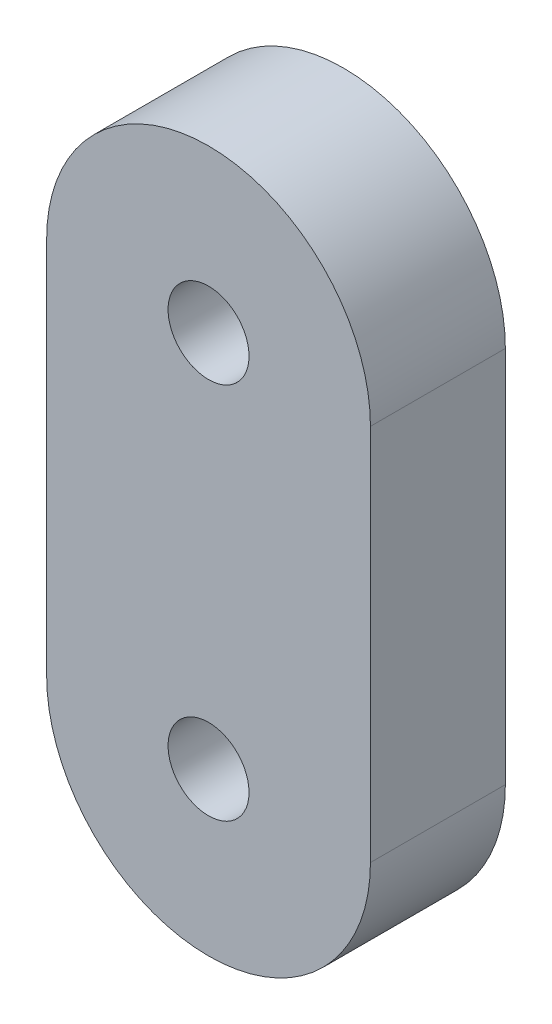
ISO-10303-21;
HEADER;
FILE_DESCRIPTION(('STEP AP214'),'2;1');
FILE_NAME('part.step','',(''),(''),'','','');
FILE_SCHEMA(('AUTOMOTIVE_DESIGN { 1 0 10303 214 1 1 1 1 }'));
ENDSEC;
DATA;
#1=APPLICATION_CONTEXT('core data for automotive mechanical design processes');
#2=APPLICATION_PROTOCOL_DEFINITION('international standard','automotive_design',2000,#1);
#3=PRODUCT_CONTEXT('',#1,'mechanical');
#4=PRODUCT('Part','Part','',(#3));
#5=PRODUCT_RELATED_PRODUCT_CATEGORY('part','',(#4));
#6=PRODUCT_DEFINITION_FORMATION('','',#4);
#7=PRODUCT_DEFINITION_CONTEXT('part definition',#1,'design');
#8=PRODUCT_DEFINITION('design','',#6,#7);
#9=PRODUCT_DEFINITION_SHAPE('','',#8);
#10=(LENGTH_UNIT() NAMED_UNIT(*) SI_UNIT(.MILLI.,.METRE.));
#11=(NAMED_UNIT(*) PLANE_ANGLE_UNIT() SI_UNIT($,.RADIAN.));
#12=(NAMED_UNIT(*) SI_UNIT($,.STERADIAN.) SOLID_ANGLE_UNIT());
#13=UNCERTAINTY_MEASURE_WITH_UNIT(LENGTH_MEASURE(1.E-05),#10,'distance_accuracy_value','');
#14=(GEOMETRIC_REPRESENTATION_CONTEXT(3) GLOBAL_UNCERTAINTY_ASSIGNED_CONTEXT((#13)) GLOBAL_UNIT_ASSIGNED_CONTEXT((#10,
#11,#12)) REPRESENTATION_CONTEXT('',''));
#15=CARTESIAN_POINT('',(0.,0.,0.));
#16=DIRECTION('',(0.,0.,1.));
#17=DIRECTION('',(1.,0.,0.));
#18=AXIS2_PLACEMENT_3D('',#15,#16,#17);
#19=CARTESIAN_POINT('',(0.,0.,5.));
#20=DIRECTION('',(0.,0.,1.));
#21=DIRECTION('',(1.,0.,0.));
#22=AXIS2_PLACEMENT_3D('',#19,#20,#21);
#23=PLANE('',#22);
#24=CARTESIAN_POINT('',(0.,0.,5.));
#25=DIRECTION('',(0.,0.,1.));
#26=DIRECTION('',(1.,0.,0.));
#27=AXIS2_PLACEMENT_3D('',#24,#25,#26);
#28=CIRCLE('',#27,1.5);
#29=CARTESIAN_POINT('',(1.5,0.,5.));
#30=VERTEX_POINT('',#29);
#31=EDGE_CURVE('E100',#30,#30,#28,.T.);
#32=ORIENTED_EDGE('',*,*,#31,.F.);
#33=EDGE_LOOP('',(#32));
#34=FACE_BOUND('',#33,.T.);
#35=CARTESIAN_POINT('',(0.,0.,5.));
#36=DIRECTION('',(0.,0.,1.));
#37=DIRECTION('',(1.,0.,0.));
#38=AXIS2_PLACEMENT_3D('',#35,#36,#37);
#39=CIRCLE('',#38,6.);
#40=CARTESIAN_POINT('',(-6.,0.,5.));
#41=VERTEX_POINT('',#40);
#42=CARTESIAN_POINT('',(6.,0.,5.));
#43=VERTEX_POINT('',#42);
#44=EDGE_CURVE('E85',#41,#43,#39,.T.);
#45=ORIENTED_EDGE('',*,*,#44,.T.);
#46=DIRECTION('',(0.,1.,0.));
#47=VECTOR('',#46,1.);
#48=CARTESIAN_POINT('',(6.,0.,5.));
#49=LINE('',#48,#47);
#50=CARTESIAN_POINT('',(6.,14.,5.));
#51=VERTEX_POINT('',#50);
#52=EDGE_CURVE('E80',#43,#51,#49,.T.);
#53=ORIENTED_EDGE('',*,*,#52,.T.);
#54=CARTESIAN_POINT('',(0.,14.,5.));
#55=DIRECTION('',(0.,0.,1.));
#56=DIRECTION('',(1.,0.,0.));
#57=AXIS2_PLACEMENT_3D('',#54,#55,#56);
#58=CIRCLE('',#57,6.);
#59=CARTESIAN_POINT('',(-6.,14.,5.));
#60=VERTEX_POINT('',#59);
#61=EDGE_CURVE('E83',#51,#60,#58,.T.);
#62=ORIENTED_EDGE('',*,*,#61,.T.);
#63=DIRECTION('',(0.,-1.,0.));
#64=VECTOR('',#63,1.);
#65=CARTESIAN_POINT('',(-6.,0.,5.));
#66=LINE('',#65,#64);
#67=EDGE_CURVE('E50',#60,#41,#66,.T.);
#68=ORIENTED_EDGE('',*,*,#67,.T.);
#69=EDGE_LOOP('',(#45,#53,#62,#68));
#70=FACE_BOUND('',#69,.T.);
#71=CARTESIAN_POINT('',(0.,14.,5.));
#72=DIRECTION('',(0.,0.,1.));
#73=DIRECTION('',(1.,0.,0.));
#74=AXIS2_PLACEMENT_3D('',#71,#72,#73);
#75=CIRCLE('',#74,1.5);
#76=CARTESIAN_POINT('',(1.5,14.,5.));
#77=VERTEX_POINT('',#76);
#78=EDGE_CURVE('E115',#77,#77,#75,.T.);
#79=ORIENTED_EDGE('',*,*,#78,.F.);
#80=EDGE_LOOP('',(#79));
#81=FACE_BOUND('',#80,.T.);
#82=ADVANCED_FACE('F33',(#34,#70,#81),#23,.T.);
#83=CARTESIAN_POINT('',(0.,0.,0.));
#84=DIRECTION('',(0.,0.,1.));
#85=DIRECTION('',(1.,0.,0.));
#86=AXIS2_PLACEMENT_3D('',#83,#84,#85);
#87=PLANE('',#86);
#88=CARTESIAN_POINT('',(0.,0.,0.));
#89=DIRECTION('',(0.,0.,1.));
#90=DIRECTION('',(1.,0.,0.));
#91=AXIS2_PLACEMENT_3D('',#88,#89,#90);
#92=CIRCLE('',#91,1.5);
#93=CARTESIAN_POINT('',(1.5,0.,0.));
#94=VERTEX_POINT('',#93);
#95=EDGE_CURVE('E112',#94,#94,#92,.T.);
#96=ORIENTED_EDGE('',*,*,#95,.T.);
#97=EDGE_LOOP('',(#96));
#98=FACE_BOUND('',#97,.T.);
#99=CARTESIAN_POINT('',(0.,0.,0.));
#100=DIRECTION('',(0.,0.,1.));
#101=DIRECTION('',(1.,0.,0.));
#102=AXIS2_PLACEMENT_3D('',#99,#100,#101);
#103=CIRCLE('',#102,6.);
#104=CARTESIAN_POINT('',(-6.,0.,0.));
#105=VERTEX_POINT('',#104);
#106=CARTESIAN_POINT('',(6.,0.,0.));
#107=VERTEX_POINT('',#106);
#108=EDGE_CURVE('E97',#105,#107,#103,.T.);
#109=ORIENTED_EDGE('',*,*,#108,.F.);
#110=DIRECTION('',(0.,-1.,0.));
#111=VECTOR('',#110,1.);
#112=CARTESIAN_POINT('',(-6.,0.,0.));
#113=LINE('',#112,#111);
#114=CARTESIAN_POINT('',(-6.,14.,0.));
#115=VERTEX_POINT('',#114);
#116=EDGE_CURVE('E73',#115,#105,#113,.T.);
#117=ORIENTED_EDGE('',*,*,#116,.F.);
#118=CARTESIAN_POINT('',(0.,14.,0.));
#119=DIRECTION('',(0.,0.,1.));
#120=DIRECTION('',(1.,0.,0.));
#121=AXIS2_PLACEMENT_3D('',#118,#119,#120);
#122=CIRCLE('',#121,6.);
#123=CARTESIAN_POINT('',(6.,14.,0.));
#124=VERTEX_POINT('',#123);
#125=EDGE_CURVE('E67',#124,#115,#122,.T.);
#126=ORIENTED_EDGE('',*,*,#125,.F.);
#127=DIRECTION('',(0.,1.,0.));
#128=VECTOR('',#127,1.);
#129=CARTESIAN_POINT('',(6.,0.,0.));
#130=LINE('',#129,#128);
#131=EDGE_CURVE('E89',#107,#124,#130,.T.);
#132=ORIENTED_EDGE('',*,*,#131,.F.);
#133=EDGE_LOOP('',(#109,#117,#126,#132));
#134=FACE_BOUND('',#133,.T.);
#135=CARTESIAN_POINT('',(0.,14.,0.));
#136=DIRECTION('',(0.,0.,1.));
#137=DIRECTION('',(1.,0.,0.));
#138=AXIS2_PLACEMENT_3D('',#135,#136,#137);
#139=CIRCLE('',#138,1.5);
#140=CARTESIAN_POINT('',(1.5,14.,0.));
#141=VERTEX_POINT('',#140);
#142=EDGE_CURVE('E118',#141,#141,#139,.T.);
#143=ORIENTED_EDGE('',*,*,#142,.T.);
#144=EDGE_LOOP('',(#143));
#145=FACE_BOUND('',#144,.T.);
#146=ADVANCED_FACE('F108',(#98,#134,#145),#87,.F.);
#147=CARTESIAN_POINT('',(0.,0.,5.));
#148=DIRECTION('',(0.,0.,-1.));
#149=DIRECTION('',(-1.,0.,0.));
#150=AXIS2_PLACEMENT_3D('',#147,#148,#149);
#151=CYLINDRICAL_SURFACE('',#150,6.);
#152=ORIENTED_EDGE('',*,*,#108,.T.);
#153=DIRECTION('',(0.,0.,-1.));
#154=VECTOR('',#153,1.);
#155=CARTESIAN_POINT('',(6.,0.,5.));
#156=LINE('',#155,#154);
#157=EDGE_CURVE('E11',#43,#107,#156,.T.);
#158=ORIENTED_EDGE('',*,*,#157,.F.);
#159=ORIENTED_EDGE('',*,*,#44,.F.);
#160=DIRECTION('',(0.,0.,-1.));
#161=VECTOR('',#160,1.);
#162=CARTESIAN_POINT('',(-6.,0.,5.));
#163=LINE('',#162,#161);
#164=EDGE_CURVE('E93',#41,#105,#163,.T.);
#165=ORIENTED_EDGE('',*,*,#164,.T.);
#166=EDGE_LOOP('',(#152,#158,#159,#165));
#167=FACE_BOUND('',#166,.T.);
#168=ADVANCED_FACE('F35',(#167),#151,.T.);
#169=CARTESIAN_POINT('',(6.,0.,5.));
#170=DIRECTION('',(-1.,0.,0.));
#171=DIRECTION('',(0.,0.,1.));
#172=AXIS2_PLACEMENT_3D('',#169,#170,#171);
#173=PLANE('',#172);
#174=ORIENTED_EDGE('',*,*,#131,.T.);
#175=DIRECTION('',(0.,0.,-1.));
#176=VECTOR('',#175,1.);
#177=CARTESIAN_POINT('',(6.,14.,5.));
#178=LINE('',#177,#176);
#179=EDGE_CURVE('E42',#51,#124,#178,.T.);
#180=ORIENTED_EDGE('',*,*,#179,.F.);
#181=ORIENTED_EDGE('',*,*,#52,.F.);
#182=ORIENTED_EDGE('',*,*,#157,.T.);
#183=EDGE_LOOP('',(#174,#180,#181,#182));
#184=FACE_BOUND('',#183,.T.);
#185=ADVANCED_FACE('F88',(#184),#173,.F.);
#186=CARTESIAN_POINT('',(0.,14.,5.));
#187=DIRECTION('',(0.,0.,-1.));
#188=DIRECTION('',(-1.,0.,0.));
#189=AXIS2_PLACEMENT_3D('',#186,#187,#188);
#190=CYLINDRICAL_SURFACE('',#189,6.);
#191=ORIENTED_EDGE('',*,*,#125,.T.);
#192=DIRECTION('',(0.,0.,-1.));
#193=VECTOR('',#192,1.);
#194=CARTESIAN_POINT('',(-6.,14.,5.));
#195=LINE('',#194,#193);
#196=EDGE_CURVE('E90',#60,#115,#195,.T.);
#197=ORIENTED_EDGE('',*,*,#196,.F.);
#198=ORIENTED_EDGE('',*,*,#61,.F.);
#199=ORIENTED_EDGE('',*,*,#179,.T.);
#200=EDGE_LOOP('',(#191,#197,#198,#199));
#201=FACE_BOUND('',#200,.T.);
#202=ADVANCED_FACE('F91',(#201),#190,.T.);
#203=CARTESIAN_POINT('',(-6.,0.,5.));
#204=DIRECTION('',(1.,0.,0.));
#205=DIRECTION('',(0.,0.,-1.));
#206=AXIS2_PLACEMENT_3D('',#203,#204,#205);
#207=PLANE('',#206);
#208=ORIENTED_EDGE('',*,*,#116,.T.);
#209=ORIENTED_EDGE('',*,*,#164,.F.);
#210=ORIENTED_EDGE('',*,*,#67,.F.);
#211=ORIENTED_EDGE('',*,*,#196,.T.);
#212=EDGE_LOOP('',(#208,#209,#210,#211));
#213=FACE_BOUND('',#212,.T.);
#214=ADVANCED_FACE('F105',(#213),#207,.F.);
#215=CARTESIAN_POINT('',(0.,0.,5.));
#216=DIRECTION('',(0.,0.,-1.));
#217=DIRECTION('',(-1.,0.,0.));
#218=AXIS2_PLACEMENT_3D('',#215,#216,#217);
#219=CYLINDRICAL_SURFACE('',#218,1.5);
#220=ORIENTED_EDGE('',*,*,#31,.T.);
#221=EDGE_LOOP('',(#220));
#222=FACE_BOUND('',#221,.T.);
#223=ORIENTED_EDGE('',*,*,#95,.F.);
#224=EDGE_LOOP('',(#223));
#225=FACE_BOUND('',#224,.T.);
#226=ADVANCED_FACE('F136',(#222,#225),#219,.F.);
#227=CARTESIAN_POINT('',(0.,14.,5.));
#228=DIRECTION('',(0.,0.,-1.));
#229=DIRECTION('',(-1.,0.,0.));
#230=AXIS2_PLACEMENT_3D('',#227,#228,#229);
#231=CYLINDRICAL_SURFACE('',#230,1.5);
#232=ORIENTED_EDGE('',*,*,#78,.T.);
#233=EDGE_LOOP('',(#232));
#234=FACE_BOUND('',#233,.T.);
#235=ORIENTED_EDGE('',*,*,#142,.F.);
#236=EDGE_LOOP('',(#235));
#237=FACE_BOUND('',#236,.T.);
#238=ADVANCED_FACE('F124',(#234,#237),#231,.F.);
#239=CLOSED_SHELL('',(#82,#146,#168,#185,#202,#214,#226,#238));
#240=MANIFOLD_SOLID_BREP('B2',#239);
#241=ADVANCED_BREP_SHAPE_REPRESENTATION('',(#18,#240),#14);
#242=SHAPE_DEFINITION_REPRESENTATION(#9,#241);
ENDSEC;
END-ISO-10303-21;
